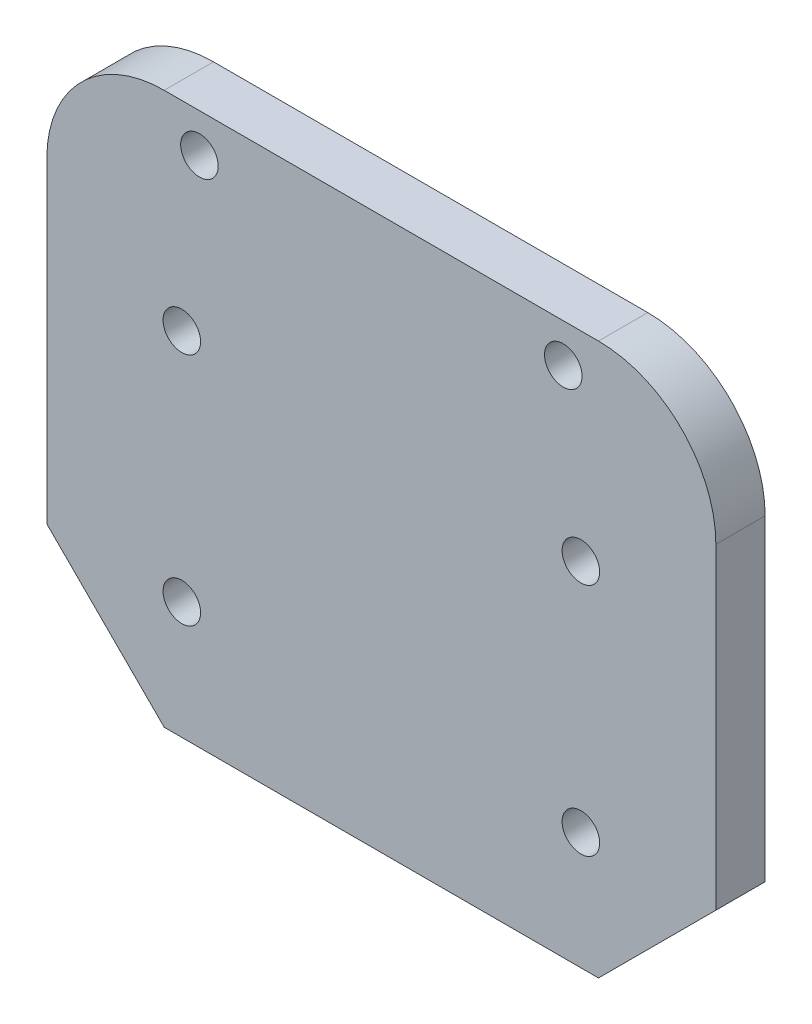
ISO-10303-21;
HEADER;
FILE_DESCRIPTION(('STEP AP214'),'2;1');
FILE_NAME('part.step','',(''),(''),'','','');
FILE_SCHEMA(('AUTOMOTIVE_DESIGN { 1 0 10303 214 1 1 1 1 }'));
ENDSEC;
DATA;
#1=APPLICATION_CONTEXT('core data for automotive mechanical design processes');
#2=APPLICATION_PROTOCOL_DEFINITION('international standard','automotive_design',2000,#1);
#3=PRODUCT_CONTEXT('',#1,'mechanical');
#4=PRODUCT('Part','Part','',(#3));
#5=PRODUCT_RELATED_PRODUCT_CATEGORY('part','',(#4));
#6=PRODUCT_DEFINITION_FORMATION('','',#4);
#7=PRODUCT_DEFINITION_CONTEXT('part definition',#1,'design');
#8=PRODUCT_DEFINITION('design','',#6,#7);
#9=PRODUCT_DEFINITION_SHAPE('','',#8);
#10=(LENGTH_UNIT() NAMED_UNIT(*) SI_UNIT(.MILLI.,.METRE.));
#11=(NAMED_UNIT(*) PLANE_ANGLE_UNIT() SI_UNIT($,.RADIAN.));
#12=(NAMED_UNIT(*) SI_UNIT($,.STERADIAN.) SOLID_ANGLE_UNIT());
#13=UNCERTAINTY_MEASURE_WITH_UNIT(LENGTH_MEASURE(1.E-05),#10,'distance_accuracy_value','');
#14=(GEOMETRIC_REPRESENTATION_CONTEXT(3) GLOBAL_UNCERTAINTY_ASSIGNED_CONTEXT((#13)) GLOBAL_UNIT_ASSIGNED_CONTEXT((#10,
#11,#12)) REPRESENTATION_CONTEXT('',''));
#15=CARTESIAN_POINT('',(0.,0.,0.));
#16=DIRECTION('',(0.,0.,1.));
#17=DIRECTION('',(1.,0.,0.));
#18=AXIS2_PLACEMENT_3D('',#15,#16,#17);
#19=CARTESIAN_POINT('',(-47.,37.,4.2));
#20=DIRECTION('',(0.,0.,-1.));
#21=DIRECTION('',(-1.,0.,0.));
#22=AXIS2_PLACEMENT_3D('',#19,#20,#21);
#23=PLANE('',#22);
#24=DIRECTION('',(1.,0.,0.));
#25=VECTOR('',#24,1.);
#26=CARTESIAN_POINT('',(0.,0.,4.2));
#27=LINE('',#26,#25);
#28=CARTESIAN_POINT('',(-47.,0.,4.2));
#29=VERTEX_POINT('',#28);
#30=CARTESIAN_POINT('',(-10.,0.,4.2));
#31=VERTEX_POINT('',#30);
#32=EDGE_CURVE('E118',#29,#31,#27,.T.);
#33=ORIENTED_EDGE('',*,*,#32,.T.);
#34=DIRECTION('',(-0.707106781186549,-0.707106781186546,0.));
#35=VECTOR('',#34,1.);
#36=CARTESIAN_POINT('',(0.,9.99999999999999,4.2));
#37=LINE('',#36,#35);
#38=CARTESIAN_POINT('',(0.,9.99999999999999,4.2));
#39=VERTEX_POINT('',#38);
#40=EDGE_CURVE('E50',#31,#39,#37,.F.);
#41=ORIENTED_EDGE('',*,*,#40,.T.);
#42=DIRECTION('',(0.,1.,0.));
#43=VECTOR('',#42,1.);
#44=CARTESIAN_POINT('',(0.,0.,4.2));
#45=LINE('',#44,#43);
#46=CARTESIAN_POINT('',(0.,36.9999999999999,4.2));
#47=VERTEX_POINT('',#46);
#48=EDGE_CURVE('E108',#39,#47,#45,.T.);
#49=ORIENTED_EDGE('',*,*,#48,.T.);
#50=CARTESIAN_POINT('',(-10.,37.,4.2));
#51=DIRECTION('',(0.,0.,1.));
#52=DIRECTION('',(1.,0.,0.));
#53=AXIS2_PLACEMENT_3D('',#50,#51,#52);
#54=CIRCLE('',#53,10.);
#55=CARTESIAN_POINT('',(-10.0000000000001,47.,4.2));
#56=VERTEX_POINT('',#55);
#57=EDGE_CURVE('E112',#47,#56,#54,.T.);
#58=ORIENTED_EDGE('',*,*,#57,.T.);
#59=DIRECTION('',(-1.,0.,0.));
#60=VECTOR('',#59,1.);
#61=CARTESIAN_POINT('',(-10.0000000000001,47.,4.2));
#62=LINE('',#61,#60);
#63=CARTESIAN_POINT('',(-46.9999999999999,47.,4.2));
#64=VERTEX_POINT('',#63);
#65=EDGE_CURVE('E133',#56,#64,#62,.T.);
#66=ORIENTED_EDGE('',*,*,#65,.T.);
#67=CARTESIAN_POINT('',(-47.,37.,4.2));
#68=DIRECTION('',(0.,0.,1.));
#69=DIRECTION('',(-1.,0.,0.));
#70=AXIS2_PLACEMENT_3D('',#67,#68,#69);
#71=CIRCLE('',#70,10.);
#72=CARTESIAN_POINT('',(-57.,36.9999999999999,4.2));
#73=VERTEX_POINT('',#72);
#74=EDGE_CURVE('E135',#64,#73,#71,.T.);
#75=ORIENTED_EDGE('',*,*,#74,.T.);
#76=DIRECTION('',(0.,-1.,0.));
#77=VECTOR('',#76,1.);
#78=CARTESIAN_POINT('',(-57.,0.,4.2));
#79=LINE('',#78,#77);
#80=CARTESIAN_POINT('',(-57.,10.,4.2));
#81=VERTEX_POINT('',#80);
#82=EDGE_CURVE('E140',#73,#81,#79,.T.);
#83=ORIENTED_EDGE('',*,*,#82,.T.);
#84=DIRECTION('',(-0.707106781186546,0.707106781186549,0.));
#85=VECTOR('',#84,1.);
#86=CARTESIAN_POINT('',(-47.,0.,4.2));
#87=LINE('',#86,#85);
#88=EDGE_CURVE('E170',#81,#29,#87,.F.);
#89=ORIENTED_EDGE('',*,*,#88,.T.);
#90=EDGE_LOOP('',(#33,#41,#49,#58,#66,#75,#83,#89));
#91=FACE_BOUND('',#90,.T.);
#92=CARTESIAN_POINT('',(-44.,43.7,4.2));
#93=DIRECTION('',(0.,0.,1.));
#94=DIRECTION('',(1.,0.,0.));
#95=AXIS2_PLACEMENT_3D('',#92,#93,#94);
#96=CIRCLE('',#95,1.6);
#97=CARTESIAN_POINT('',(-42.4,43.7,4.2));
#98=VERTEX_POINT('',#97);
#99=EDGE_CURVE('E145',#98,#98,#96,.T.);
#100=ORIENTED_EDGE('',*,*,#99,.F.);
#101=EDGE_LOOP('',(#100));
#102=FACE_BOUND('',#101,.T.);
#103=CARTESIAN_POINT('',(-13.,43.7,4.2));
#104=DIRECTION('',(0.,0.,1.));
#105=DIRECTION('',(1.,0.,0.));
#106=AXIS2_PLACEMENT_3D('',#103,#104,#105);
#107=CIRCLE('',#106,1.6);
#108=CARTESIAN_POINT('',(-11.4,43.7,4.2));
#109=VERTEX_POINT('',#108);
#110=EDGE_CURVE('E230',#109,#109,#107,.T.);
#111=ORIENTED_EDGE('',*,*,#110,.F.);
#112=EDGE_LOOP('',(#111));
#113=FACE_BOUND('',#112,.T.);
#114=CARTESIAN_POINT('',(-45.5,10.,4.2));
#115=DIRECTION('',(0.,0.,1.));
#116=DIRECTION('',(1.,0.,0.));
#117=AXIS2_PLACEMENT_3D('',#114,#115,#116);
#118=CIRCLE('',#117,1.6);
#119=CARTESIAN_POINT('',(-43.9,10.,4.2));
#120=VERTEX_POINT('',#119);
#121=EDGE_CURVE('E238',#120,#120,#118,.T.);
#122=ORIENTED_EDGE('',*,*,#121,.F.);
#123=EDGE_LOOP('',(#122));
#124=FACE_BOUND('',#123,.T.);
#125=CARTESIAN_POINT('',(-11.5,10.,4.2));
#126=DIRECTION('',(0.,0.,1.));
#127=DIRECTION('',(1.,0.,0.));
#128=AXIS2_PLACEMENT_3D('',#125,#126,#127);
#129=CIRCLE('',#128,1.6);
#130=CARTESIAN_POINT('',(-9.89999999999999,10.,4.2));
#131=VERTEX_POINT('',#130);
#132=EDGE_CURVE('E243',#131,#131,#129,.T.);
#133=ORIENTED_EDGE('',*,*,#132,.F.);
#134=EDGE_LOOP('',(#133));
#135=FACE_BOUND('',#134,.T.);
#136=CARTESIAN_POINT('',(-45.5,30.,4.2));
#137=DIRECTION('',(0.,0.,1.));
#138=DIRECTION('',(1.,0.,0.));
#139=AXIS2_PLACEMENT_3D('',#136,#137,#138);
#140=CIRCLE('',#139,1.6);
#141=CARTESIAN_POINT('',(-43.9,30.,4.2));
#142=VERTEX_POINT('',#141);
#143=EDGE_CURVE('E249',#142,#142,#140,.T.);
#144=ORIENTED_EDGE('',*,*,#143,.F.);
#145=EDGE_LOOP('',(#144));
#146=FACE_BOUND('',#145,.T.);
#147=CARTESIAN_POINT('',(-11.5,30.,4.2));
#148=DIRECTION('',(0.,0.,1.));
#149=DIRECTION('',(1.,0.,0.));
#150=AXIS2_PLACEMENT_3D('',#147,#148,#149);
#151=CIRCLE('',#150,1.6);
#152=CARTESIAN_POINT('',(-9.9,30.,4.2));
#153=VERTEX_POINT('',#152);
#154=EDGE_CURVE('E255',#153,#153,#151,.T.);
#155=ORIENTED_EDGE('',*,*,#154,.F.);
#156=EDGE_LOOP('',(#155));
#157=FACE_BOUND('',#156,.T.);
#158=ADVANCED_FACE('F41',(#91,#102,#113,#124,#135,#146,#157),#23,.F.);
#159=CARTESIAN_POINT('',(-47.,37.,0.));
#160=DIRECTION('',(0.,0.,-1.));
#161=DIRECTION('',(-1.,0.,0.));
#162=AXIS2_PLACEMENT_3D('',#159,#160,#161);
#163=PLANE('',#162);
#164=CARTESIAN_POINT('',(-45.5,30.,0.));
#165=DIRECTION('',(0.,0.,1.));
#166=DIRECTION('',(1.,0.,0.));
#167=AXIS2_PLACEMENT_3D('',#164,#165,#166);
#168=CIRCLE('',#167,1.6);
#169=CARTESIAN_POINT('',(-43.9,30.,0.));
#170=VERTEX_POINT('',#169);
#171=EDGE_CURVE('E252',#170,#170,#168,.T.);
#172=ORIENTED_EDGE('',*,*,#171,.T.);
#173=EDGE_LOOP('',(#172));
#174=FACE_BOUND('',#173,.T.);
#175=CARTESIAN_POINT('',(-45.5,10.,0.));
#176=DIRECTION('',(0.,0.,1.));
#177=DIRECTION('',(1.,0.,0.));
#178=AXIS2_PLACEMENT_3D('',#175,#176,#177);
#179=CIRCLE('',#178,1.6);
#180=CARTESIAN_POINT('',(-43.9,10.,0.));
#181=VERTEX_POINT('',#180);
#182=EDGE_CURVE('E240',#181,#181,#179,.T.);
#183=ORIENTED_EDGE('',*,*,#182,.T.);
#184=EDGE_LOOP('',(#183));
#185=FACE_BOUND('',#184,.T.);
#186=CARTESIAN_POINT('',(-44.,43.7,0.));
#187=DIRECTION('',(0.,0.,1.));
#188=DIRECTION('',(1.,0.,0.));
#189=AXIS2_PLACEMENT_3D('',#186,#187,#188);
#190=CIRCLE('',#189,1.6);
#191=CARTESIAN_POINT('',(-42.4,43.7,0.));
#192=VERTEX_POINT('',#191);
#193=EDGE_CURVE('E228',#192,#192,#190,.T.);
#194=ORIENTED_EDGE('',*,*,#193,.T.);
#195=EDGE_LOOP('',(#194));
#196=FACE_BOUND('',#195,.T.);
#197=DIRECTION('',(0.,1.,0.));
#198=VECTOR('',#197,1.);
#199=CARTESIAN_POINT('',(0.,0.,0.));
#200=LINE('',#199,#198);
#201=CARTESIAN_POINT('',(0.,9.99999999999999,0.));
#202=VERTEX_POINT('',#201);
#203=CARTESIAN_POINT('',(0.,36.9999999999999,0.));
#204=VERTEX_POINT('',#203);
#205=EDGE_CURVE('E124',#202,#204,#200,.T.);
#206=ORIENTED_EDGE('',*,*,#205,.F.);
#207=DIRECTION('',(0.707106781186549,0.707106781186546,0.));
#208=VECTOR('',#207,1.);
#209=CARTESIAN_POINT('',(-10.0000000000001,0.,0.));
#210=LINE('',#209,#208);
#211=CARTESIAN_POINT('',(-10.,0.,0.));
#212=VERTEX_POINT('',#211);
#213=EDGE_CURVE('E164',#202,#212,#210,.F.);
#214=ORIENTED_EDGE('',*,*,#213,.T.);
#215=DIRECTION('',(1.,0.,0.));
#216=VECTOR('',#215,1.);
#217=CARTESIAN_POINT('',(0.,0.,0.));
#218=LINE('',#217,#216);
#219=CARTESIAN_POINT('',(-47.,0.,0.));
#220=VERTEX_POINT('',#219);
#221=EDGE_CURVE('E143',#220,#212,#218,.T.);
#222=ORIENTED_EDGE('',*,*,#221,.F.);
#223=DIRECTION('',(0.707106781186546,-0.707106781186549,0.));
#224=VECTOR('',#223,1.);
#225=CARTESIAN_POINT('',(-65.5,18.5000000000001,0.));
#226=LINE('',#225,#224);
#227=CARTESIAN_POINT('',(-57.,10.,0.));
#228=VERTEX_POINT('',#227);
#229=EDGE_CURVE('E162',#220,#228,#226,.F.);
#230=ORIENTED_EDGE('',*,*,#229,.T.);
#231=DIRECTION('',(0.,-1.,0.));
#232=VECTOR('',#231,1.);
#233=CARTESIAN_POINT('',(-57.,0.,0.));
#234=LINE('',#233,#232);
#235=CARTESIAN_POINT('',(-57.,36.9999999999999,0.));
#236=VERTEX_POINT('',#235);
#237=EDGE_CURVE('E153',#236,#228,#234,.T.);
#238=ORIENTED_EDGE('',*,*,#237,.F.);
#239=CARTESIAN_POINT('',(-47.,37.,0.));
#240=DIRECTION('',(0.,0.,1.));
#241=DIRECTION('',(-1.,0.,0.));
#242=AXIS2_PLACEMENT_3D('',#239,#240,#241);
#243=CIRCLE('',#242,10.);
#244=CARTESIAN_POINT('',(-46.9999999999999,47.,0.));
#245=VERTEX_POINT('',#244);
#246=EDGE_CURVE('E151',#245,#236,#243,.T.);
#247=ORIENTED_EDGE('',*,*,#246,.F.);
#248=DIRECTION('',(-1.,0.,0.));
#249=VECTOR('',#248,1.);
#250=CARTESIAN_POINT('',(-10.0000000000001,47.,0.));
#251=LINE('',#250,#249);
#252=CARTESIAN_POINT('',(-10.0000000000001,47.,0.));
#253=VERTEX_POINT('',#252);
#254=EDGE_CURVE('E149',#253,#245,#251,.T.);
#255=ORIENTED_EDGE('',*,*,#254,.F.);
#256=CARTESIAN_POINT('',(-10.,37.,0.));
#257=DIRECTION('',(0.,0.,1.));
#258=DIRECTION('',(1.,0.,0.));
#259=AXIS2_PLACEMENT_3D('',#256,#257,#258);
#260=CIRCLE('',#259,10.);
#261=EDGE_CURVE('E147',#204,#253,#260,.T.);
#262=ORIENTED_EDGE('',*,*,#261,.F.);
#263=EDGE_LOOP('',(#206,#214,#222,#230,#238,#247,#255,#262));
#264=FACE_BOUND('',#263,.T.);
#265=CARTESIAN_POINT('',(-13.,43.7,0.));
#266=DIRECTION('',(0.,0.,1.));
#267=DIRECTION('',(1.,0.,0.));
#268=AXIS2_PLACEMENT_3D('',#265,#266,#267);
#269=CIRCLE('',#268,1.6);
#270=CARTESIAN_POINT('',(-11.4,43.7,0.));
#271=VERTEX_POINT('',#270);
#272=EDGE_CURVE('E234',#271,#271,#269,.T.);
#273=ORIENTED_EDGE('',*,*,#272,.T.);
#274=EDGE_LOOP('',(#273));
#275=FACE_BOUND('',#274,.T.);
#276=CARTESIAN_POINT('',(-11.5,10.,0.));
#277=DIRECTION('',(0.,0.,1.));
#278=DIRECTION('',(1.,0.,0.));
#279=AXIS2_PLACEMENT_3D('',#276,#277,#278);
#280=CIRCLE('',#279,1.6);
#281=CARTESIAN_POINT('',(-9.89999999999999,10.,0.));
#282=VERTEX_POINT('',#281);
#283=EDGE_CURVE('E246',#282,#282,#280,.T.);
#284=ORIENTED_EDGE('',*,*,#283,.T.);
#285=EDGE_LOOP('',(#284));
#286=FACE_BOUND('',#285,.T.);
#287=CARTESIAN_POINT('',(-11.5,30.,0.));
#288=DIRECTION('',(0.,0.,1.));
#289=DIRECTION('',(1.,0.,0.));
#290=AXIS2_PLACEMENT_3D('',#287,#288,#289);
#291=CIRCLE('',#290,1.6);
#292=CARTESIAN_POINT('',(-9.9,30.,0.));
#293=VERTEX_POINT('',#292);
#294=EDGE_CURVE('E258',#293,#293,#291,.T.);
#295=ORIENTED_EDGE('',*,*,#294,.T.);
#296=EDGE_LOOP('',(#295));
#297=FACE_BOUND('',#296,.T.);
#298=ADVANCED_FACE('F178',(#174,#185,#196,#264,#275,#286,#297),#163,.T.);
#299=CARTESIAN_POINT('',(0.,0.,4.2));
#300=DIRECTION('',(0.,1.,0.));
#301=DIRECTION('',(0.,0.,1.));
#302=AXIS2_PLACEMENT_3D('',#299,#300,#301);
#303=PLANE('',#302);
#304=ORIENTED_EDGE('',*,*,#221,.T.);
#305=DIRECTION('',(0.,0.,1.));
#306=VECTOR('',#305,1.);
#307=CARTESIAN_POINT('',(-10.,0.,4.2));
#308=LINE('',#307,#306);
#309=EDGE_CURVE('E63',#212,#31,#308,.T.);
#310=ORIENTED_EDGE('',*,*,#309,.T.);
#311=ORIENTED_EDGE('',*,*,#32,.F.);
#312=DIRECTION('',(0.,0.,-1.));
#313=VECTOR('',#312,1.);
#314=CARTESIAN_POINT('',(-47.,0.,4.2));
#315=LINE('',#314,#313);
#316=EDGE_CURVE('E166',#29,#220,#315,.T.);
#317=ORIENTED_EDGE('',*,*,#316,.T.);
#318=EDGE_LOOP('',(#304,#310,#311,#317));
#319=FACE_BOUND('',#318,.T.);
#320=ADVANCED_FACE('F174',(#319),#303,.F.);
#321=CARTESIAN_POINT('',(0.,0.,4.2));
#322=DIRECTION('',(-1.,0.,0.));
#323=DIRECTION('',(0.,0.,1.));
#324=AXIS2_PLACEMENT_3D('',#321,#322,#323);
#325=PLANE('',#324);
#326=ORIENTED_EDGE('',*,*,#48,.F.);
#327=DIRECTION('',(0.,0.,-1.));
#328=VECTOR('',#327,1.);
#329=CARTESIAN_POINT('',(0.,9.99999999999999,4.2));
#330=LINE('',#329,#328);
#331=EDGE_CURVE('E127',#39,#202,#330,.T.);
#332=ORIENTED_EDGE('',*,*,#331,.T.);
#333=ORIENTED_EDGE('',*,*,#205,.T.);
#334=DIRECTION('',(0.,0.,-1.));
#335=VECTOR('',#334,1.);
#336=CARTESIAN_POINT('',(0.,36.9999999999999,4.2));
#337=LINE('',#336,#335);
#338=EDGE_CURVE('E121',#47,#204,#337,.T.);
#339=ORIENTED_EDGE('',*,*,#338,.F.);
#340=EDGE_LOOP('',(#326,#332,#333,#339));
#341=FACE_BOUND('',#340,.T.);
#342=ADVANCED_FACE('F122',(#341),#325,.F.);
#343=CARTESIAN_POINT('',(-10.,37.,4.2));
#344=DIRECTION('',(0.,0.,-1.));
#345=DIRECTION('',(-1.,0.,0.));
#346=AXIS2_PLACEMENT_3D('',#343,#344,#345);
#347=CYLINDRICAL_SURFACE('',#346,10.);
#348=ORIENTED_EDGE('',*,*,#261,.T.);
#349=DIRECTION('',(0.,0.,-1.));
#350=VECTOR('',#349,1.);
#351=CARTESIAN_POINT('',(-10.0000000000001,47.,4.2));
#352=LINE('',#351,#350);
#353=EDGE_CURVE('E128',#56,#253,#352,.T.);
#354=ORIENTED_EDGE('',*,*,#353,.F.);
#355=ORIENTED_EDGE('',*,*,#57,.F.);
#356=ORIENTED_EDGE('',*,*,#338,.T.);
#357=EDGE_LOOP('',(#348,#354,#355,#356));
#358=FACE_BOUND('',#357,.T.);
#359=ADVANCED_FACE('F130',(#358),#347,.T.);
#360=CARTESIAN_POINT('',(-10.0000000000001,47.,4.2));
#361=DIRECTION('',(0.,-1.,0.));
#362=DIRECTION('',(0.,0.,-1.));
#363=AXIS2_PLACEMENT_3D('',#360,#361,#362);
#364=PLANE('',#363);
#365=ORIENTED_EDGE('',*,*,#254,.T.);
#366=DIRECTION('',(0.,0.,-1.));
#367=VECTOR('',#366,1.);
#368=CARTESIAN_POINT('',(-46.9999999999999,47.,4.2));
#369=LINE('',#368,#367);
#370=EDGE_CURVE('E157',#64,#245,#369,.T.);
#371=ORIENTED_EDGE('',*,*,#370,.F.);
#372=ORIENTED_EDGE('',*,*,#65,.F.);
#373=ORIENTED_EDGE('',*,*,#353,.T.);
#374=EDGE_LOOP('',(#365,#371,#372,#373));
#375=FACE_BOUND('',#374,.T.);
#376=ADVANCED_FACE('F189',(#375),#364,.F.);
#377=CARTESIAN_POINT('',(-47.,37.,4.2));
#378=DIRECTION('',(0.,0.,-1.));
#379=DIRECTION('',(-1.,0.,0.));
#380=AXIS2_PLACEMENT_3D('',#377,#378,#379);
#381=CYLINDRICAL_SURFACE('',#380,10.);
#382=ORIENTED_EDGE('',*,*,#246,.T.);
#383=DIRECTION('',(0.,0.,-1.));
#384=VECTOR('',#383,1.);
#385=CARTESIAN_POINT('',(-57.,36.9999999999999,4.2));
#386=LINE('',#385,#384);
#387=EDGE_CURVE('E142',#73,#236,#386,.T.);
#388=ORIENTED_EDGE('',*,*,#387,.F.);
#389=ORIENTED_EDGE('',*,*,#74,.F.);
#390=ORIENTED_EDGE('',*,*,#370,.T.);
#391=EDGE_LOOP('',(#382,#388,#389,#390));
#392=FACE_BOUND('',#391,.T.);
#393=ADVANCED_FACE('F185',(#392),#381,.T.);
#394=CARTESIAN_POINT('',(-57.,0.,4.2));
#395=DIRECTION('',(1.,0.,0.));
#396=DIRECTION('',(0.,0.,-1.));
#397=AXIS2_PLACEMENT_3D('',#394,#395,#396);
#398=PLANE('',#397);
#399=ORIENTED_EDGE('',*,*,#237,.T.);
#400=DIRECTION('',(0.,0.,1.));
#401=VECTOR('',#400,1.);
#402=CARTESIAN_POINT('',(-57.,10.,4.2));
#403=LINE('',#402,#401);
#404=EDGE_CURVE('E11',#228,#81,#403,.T.);
#405=ORIENTED_EDGE('',*,*,#404,.T.);
#406=ORIENTED_EDGE('',*,*,#82,.F.);
#407=ORIENTED_EDGE('',*,*,#387,.T.);
#408=EDGE_LOOP('',(#399,#405,#406,#407));
#409=FACE_BOUND('',#408,.T.);
#410=ADVANCED_FACE('F181',(#409),#398,.F.);
#411=CARTESIAN_POINT('',(-44.,43.7,4.2));
#412=DIRECTION('',(0.,0.,-1.));
#413=DIRECTION('',(-1.,0.,0.));
#414=AXIS2_PLACEMENT_3D('',#411,#412,#413);
#415=CYLINDRICAL_SURFACE('',#414,1.6);
#416=ORIENTED_EDGE('',*,*,#99,.T.);
#417=EDGE_LOOP('',(#416));
#418=FACE_BOUND('',#417,.T.);
#419=ORIENTED_EDGE('',*,*,#193,.F.);
#420=EDGE_LOOP('',(#419));
#421=FACE_BOUND('',#420,.T.);
#422=ADVANCED_FACE('F207',(#418,#421),#415,.F.);
#423=CARTESIAN_POINT('',(-13.,43.7,4.2));
#424=DIRECTION('',(0.,0.,-1.));
#425=DIRECTION('',(-1.,0.,0.));
#426=AXIS2_PLACEMENT_3D('',#423,#424,#425);
#427=CYLINDRICAL_SURFACE('',#426,1.6);
#428=ORIENTED_EDGE('',*,*,#110,.T.);
#429=EDGE_LOOP('',(#428));
#430=FACE_BOUND('',#429,.T.);
#431=ORIENTED_EDGE('',*,*,#272,.F.);
#432=EDGE_LOOP('',(#431));
#433=FACE_BOUND('',#432,.T.);
#434=ADVANCED_FACE('F216',(#430,#433),#427,.F.);
#435=CARTESIAN_POINT('',(-45.5,10.,4.2));
#436=DIRECTION('',(0.,0.,-1.));
#437=DIRECTION('',(-1.,0.,0.));
#438=AXIS2_PLACEMENT_3D('',#435,#436,#437);
#439=CYLINDRICAL_SURFACE('',#438,1.6);
#440=ORIENTED_EDGE('',*,*,#121,.T.);
#441=EDGE_LOOP('',(#440));
#442=FACE_BOUND('',#441,.T.);
#443=ORIENTED_EDGE('',*,*,#182,.F.);
#444=EDGE_LOOP('',(#443));
#445=FACE_BOUND('',#444,.T.);
#446=ADVANCED_FACE('F221',(#442,#445),#439,.F.);
#447=CARTESIAN_POINT('',(-11.5,10.,4.2));
#448=DIRECTION('',(0.,0.,-1.));
#449=DIRECTION('',(-1.,0.,0.));
#450=AXIS2_PLACEMENT_3D('',#447,#448,#449);
#451=CYLINDRICAL_SURFACE('',#450,1.6);
#452=ORIENTED_EDGE('',*,*,#132,.T.);
#453=EDGE_LOOP('',(#452));
#454=FACE_BOUND('',#453,.T.);
#455=ORIENTED_EDGE('',*,*,#283,.F.);
#456=EDGE_LOOP('',(#455));
#457=FACE_BOUND('',#456,.T.);
#458=ADVANCED_FACE('F276',(#454,#457),#451,.F.);
#459=CARTESIAN_POINT('',(-45.5,30.,4.2));
#460=DIRECTION('',(0.,0.,-1.));
#461=DIRECTION('',(-1.,0.,0.));
#462=AXIS2_PLACEMENT_3D('',#459,#460,#461);
#463=CYLINDRICAL_SURFACE('',#462,1.6);
#464=ORIENTED_EDGE('',*,*,#143,.T.);
#465=EDGE_LOOP('',(#464));
#466=FACE_BOUND('',#465,.T.);
#467=ORIENTED_EDGE('',*,*,#171,.F.);
#468=EDGE_LOOP('',(#467));
#469=FACE_BOUND('',#468,.T.);
#470=ADVANCED_FACE('F268',(#466,#469),#463,.F.);
#471=CARTESIAN_POINT('',(-11.5,30.,4.2));
#472=DIRECTION('',(0.,0.,-1.));
#473=DIRECTION('',(-1.,0.,0.));
#474=AXIS2_PLACEMENT_3D('',#471,#472,#473);
#475=CYLINDRICAL_SURFACE('',#474,1.6);
#476=ORIENTED_EDGE('',*,*,#154,.T.);
#477=EDGE_LOOP('',(#476));
#478=FACE_BOUND('',#477,.T.);
#479=ORIENTED_EDGE('',*,*,#294,.F.);
#480=EDGE_LOOP('',(#479));
#481=FACE_BOUND('',#480,.T.);
#482=ADVANCED_FACE('F264',(#478,#481),#475,.F.);
#483=CARTESIAN_POINT('',(0.,9.99999999999999,4.2));
#484=DIRECTION('',(-0.707106781186546,0.707106781186549,0.));
#485=DIRECTION('',(0.,0.,-1.));
#486=AXIS2_PLACEMENT_3D('',#483,#484,#485);
#487=PLANE('',#486);
#488=ORIENTED_EDGE('',*,*,#40,.F.);
#489=ORIENTED_EDGE('',*,*,#309,.F.);
#490=ORIENTED_EDGE('',*,*,#213,.F.);
#491=ORIENTED_EDGE('',*,*,#331,.F.);
#492=EDGE_LOOP('',(#488,#489,#490,#491));
#493=FACE_BOUND('',#492,.T.);
#494=ADVANCED_FACE('F267',(#493),#487,.F.);
#495=CARTESIAN_POINT('',(-47.,0.,4.2));
#496=DIRECTION('',(0.707106781186549,0.707106781186546,0.));
#497=DIRECTION('',(0.,0.,-1.));
#498=AXIS2_PLACEMENT_3D('',#495,#496,#497);
#499=PLANE('',#498);
#500=ORIENTED_EDGE('',*,*,#88,.F.);
#501=ORIENTED_EDGE('',*,*,#404,.F.);
#502=ORIENTED_EDGE('',*,*,#229,.F.);
#503=ORIENTED_EDGE('',*,*,#316,.F.);
#504=EDGE_LOOP('',(#500,#501,#502,#503));
#505=FACE_BOUND('',#504,.T.);
#506=ADVANCED_FACE('F44',(#505),#499,.F.);
#507=CLOSED_SHELL('',(#158,#298,#320,#342,#359,#376,#393,#410,#422,#434,#446,#458,#470,#482,
#494,#506));
#508=MANIFOLD_SOLID_BREP('B2',#507);
#509=ADVANCED_BREP_SHAPE_REPRESENTATION('',(#18,#508),#14);
#510=SHAPE_DEFINITION_REPRESENTATION(#9,#509);
ENDSEC;
END-ISO-10303-21;
